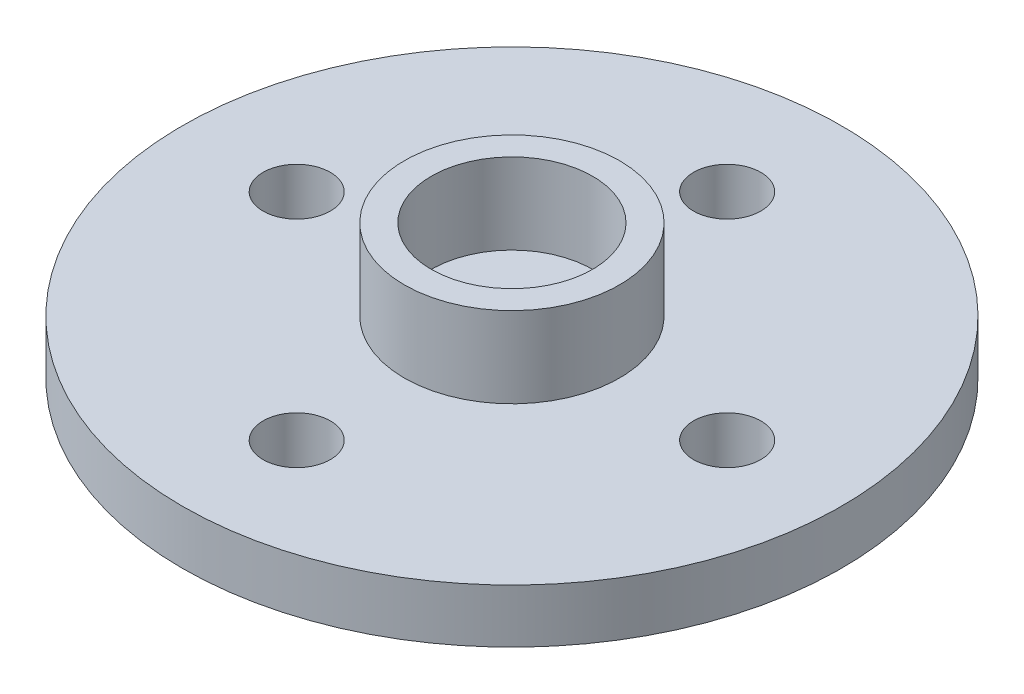
ISO-10303-21;
HEADER;
FILE_DESCRIPTION(('STEP AP214'),'2;1');
FILE_NAME('part.step','',(''),(''),'','','');
FILE_SCHEMA(('AUTOMOTIVE_DESIGN { 1 0 10303 214 1 1 1 1 }'));
ENDSEC;
DATA;
#1=APPLICATION_CONTEXT('core data for automotive mechanical design processes');
#2=APPLICATION_PROTOCOL_DEFINITION('international standard','automotive_design',2000,#1);
#3=PRODUCT_CONTEXT('',#1,'mechanical');
#4=PRODUCT('Part','Part','',(#3));
#5=PRODUCT_RELATED_PRODUCT_CATEGORY('part','',(#4));
#6=PRODUCT_DEFINITION_FORMATION('','',#4);
#7=PRODUCT_DEFINITION_CONTEXT('part definition',#1,'design');
#8=PRODUCT_DEFINITION('design','',#6,#7);
#9=PRODUCT_DEFINITION_SHAPE('','',#8);
#10=(LENGTH_UNIT() NAMED_UNIT(*) SI_UNIT(.MILLI.,.METRE.));
#11=(NAMED_UNIT(*) PLANE_ANGLE_UNIT() SI_UNIT($,.RADIAN.));
#12=(NAMED_UNIT(*) SI_UNIT($,.STERADIAN.) SOLID_ANGLE_UNIT());
#13=UNCERTAINTY_MEASURE_WITH_UNIT(LENGTH_MEASURE(1.E-05),#10,'distance_accuracy_value','');
#14=(GEOMETRIC_REPRESENTATION_CONTEXT(3) GLOBAL_UNCERTAINTY_ASSIGNED_CONTEXT((#13)) GLOBAL_UNIT_ASSIGNED_CONTEXT((#10,
#11,#12)) REPRESENTATION_CONTEXT('',''));
#15=CARTESIAN_POINT('',(0.,0.,0.));
#16=DIRECTION('',(0.,0.,1.));
#17=DIRECTION('',(1.,0.,0.));
#18=AXIS2_PLACEMENT_3D('',#15,#16,#17);
#19=CARTESIAN_POINT('',(0.,2.,0.));
#20=DIRECTION('',(0.,-1.,0.));
#21=DIRECTION('',(0.,0.,-1.));
#22=AXIS2_PLACEMENT_3D('',#19,#20,#21);
#23=CYLINDRICAL_SURFACE('',#22,12.25);
#24=CARTESIAN_POINT('',(0.,2.,0.));
#25=DIRECTION('',(0.,1.,0.));
#26=DIRECTION('',(0.,0.,1.));
#27=AXIS2_PLACEMENT_3D('',#24,#25,#26);
#28=CIRCLE('',#27,12.25);
#29=CARTESIAN_POINT('',(0.,2.,12.25));
#30=VERTEX_POINT('',#29);
#31=EDGE_CURVE('E40',#30,#30,#28,.T.);
#32=ORIENTED_EDGE('',*,*,#31,.F.);
#33=EDGE_LOOP('',(#32));
#34=FACE_BOUND('',#33,.T.);
#35=CARTESIAN_POINT('',(0.,0.,0.));
#36=DIRECTION('',(0.,1.,0.));
#37=DIRECTION('',(0.,0.,1.));
#38=AXIS2_PLACEMENT_3D('',#35,#36,#37);
#39=CIRCLE('',#38,12.25);
#40=CARTESIAN_POINT('',(0.,0.,12.25));
#41=VERTEX_POINT('',#40);
#42=EDGE_CURVE('E45',#41,#41,#39,.T.);
#43=ORIENTED_EDGE('',*,*,#42,.T.);
#44=EDGE_LOOP('',(#43));
#45=FACE_BOUND('',#44,.T.);
#46=ADVANCED_FACE('F33',(#34,#45),#23,.T.);
#47=CARTESIAN_POINT('',(0.,2.,0.));
#48=DIRECTION('',(0.,1.,0.));
#49=DIRECTION('',(0.,0.,1.));
#50=AXIS2_PLACEMENT_3D('',#47,#48,#49);
#51=PLANE('',#50);
#52=CARTESIAN_POINT('',(-8.,2.,0.));
#53=DIRECTION('',(0.,1.,0.));
#54=DIRECTION('',(0.,0.,1.));
#55=AXIS2_PLACEMENT_3D('',#52,#53,#54);
#56=CIRCLE('',#55,1.25);
#57=CARTESIAN_POINT('',(-8.,2.,1.25));
#58=VERTEX_POINT('',#57);
#59=EDGE_CURVE('E57',#58,#58,#56,.T.);
#60=ORIENTED_EDGE('',*,*,#59,.F.);
#61=EDGE_LOOP('',(#60));
#62=FACE_BOUND('',#61,.T.);
#63=CARTESIAN_POINT('',(0.,2.,-8.));
#64=DIRECTION('',(0.,1.,0.));
#65=DIRECTION('',(0.,0.,1.));
#66=AXIS2_PLACEMENT_3D('',#63,#64,#65);
#67=CIRCLE('',#66,1.25);
#68=CARTESIAN_POINT('',(0.,2.,-6.75));
#69=VERTEX_POINT('',#68);
#70=EDGE_CURVE('E103',#69,#69,#67,.T.);
#71=ORIENTED_EDGE('',*,*,#70,.F.);
#72=EDGE_LOOP('',(#71));
#73=FACE_BOUND('',#72,.T.);
#74=CARTESIAN_POINT('',(8.,2.,0.));
#75=DIRECTION('',(0.,1.,0.));
#76=DIRECTION('',(0.,0.,1.));
#77=AXIS2_PLACEMENT_3D('',#74,#75,#76);
#78=CIRCLE('',#77,1.25);
#79=CARTESIAN_POINT('',(8.,2.,1.25));
#80=VERTEX_POINT('',#79);
#81=EDGE_CURVE('E107',#80,#80,#78,.T.);
#82=ORIENTED_EDGE('',*,*,#81,.F.);
#83=EDGE_LOOP('',(#82));
#84=FACE_BOUND('',#83,.T.);
#85=CARTESIAN_POINT('',(0.,2.,8.));
#86=DIRECTION('',(0.,1.,0.));
#87=DIRECTION('',(0.,0.,1.));
#88=AXIS2_PLACEMENT_3D('',#85,#86,#87);
#89=CIRCLE('',#88,1.25);
#90=CARTESIAN_POINT('',(0.,2.,9.25));
#91=VERTEX_POINT('',#90);
#92=EDGE_CURVE('E111',#91,#91,#89,.T.);
#93=ORIENTED_EDGE('',*,*,#92,.F.);
#94=EDGE_LOOP('',(#93));
#95=FACE_BOUND('',#94,.T.);
#96=CARTESIAN_POINT('',(0.,2.,0.));
#97=DIRECTION('',(0.,1.,0.));
#98=DIRECTION('',(0.,0.,1.));
#99=AXIS2_PLACEMENT_3D('',#96,#97,#98);
#100=CIRCLE('',#99,4.);
#101=CARTESIAN_POINT('',(0.,2.,4.));
#102=VERTEX_POINT('',#101);
#103=EDGE_CURVE('E10',#102,#102,#100,.T.);
#104=ORIENTED_EDGE('',*,*,#103,.F.);
#105=EDGE_LOOP('',(#104));
#106=FACE_BOUND('',#105,.T.);
#107=ORIENTED_EDGE('',*,*,#31,.T.);
#108=EDGE_LOOP('',(#107));
#109=FACE_BOUND('',#108,.T.);
#110=ADVANCED_FACE('F82',(#62,#73,#84,#95,#106,#109),#51,.T.);
#111=CARTESIAN_POINT('',(0.,0.,0.));
#112=DIRECTION('',(0.,1.,0.));
#113=DIRECTION('',(0.,0.,1.));
#114=AXIS2_PLACEMENT_3D('',#111,#112,#113);
#115=PLANE('',#114);
#116=CARTESIAN_POINT('',(-8.,0.,0.));
#117=DIRECTION('',(0.,1.,0.));
#118=DIRECTION('',(0.,0.,1.));
#119=AXIS2_PLACEMENT_3D('',#116,#117,#118);
#120=CIRCLE('',#119,1.25);
#121=CARTESIAN_POINT('',(-8.,0.,1.25));
#122=VERTEX_POINT('',#121);
#123=EDGE_CURVE('E36',#122,#122,#120,.T.);
#124=ORIENTED_EDGE('',*,*,#123,.T.);
#125=EDGE_LOOP('',(#124));
#126=FACE_BOUND('',#125,.T.);
#127=CARTESIAN_POINT('',(0.,0.,-8.));
#128=DIRECTION('',(0.,1.,0.));
#129=DIRECTION('',(0.,0.,1.));
#130=AXIS2_PLACEMENT_3D('',#127,#128,#129);
#131=CIRCLE('',#130,1.25);
#132=CARTESIAN_POINT('',(0.,0.,-6.75));
#133=VERTEX_POINT('',#132);
#134=EDGE_CURVE('E59',#133,#133,#131,.T.);
#135=ORIENTED_EDGE('',*,*,#134,.T.);
#136=EDGE_LOOP('',(#135));
#137=FACE_BOUND('',#136,.T.);
#138=CARTESIAN_POINT('',(8.,0.,0.));
#139=DIRECTION('',(0.,1.,0.));
#140=DIRECTION('',(0.,0.,1.));
#141=AXIS2_PLACEMENT_3D('',#138,#139,#140);
#142=CIRCLE('',#141,1.25);
#143=CARTESIAN_POINT('',(8.,0.,1.25));
#144=VERTEX_POINT('',#143);
#145=EDGE_CURVE('E56',#144,#144,#142,.T.);
#146=ORIENTED_EDGE('',*,*,#145,.T.);
#147=EDGE_LOOP('',(#146));
#148=FACE_BOUND('',#147,.T.);
#149=CARTESIAN_POINT('',(0.,0.,8.));
#150=DIRECTION('',(0.,1.,0.));
#151=DIRECTION('',(0.,0.,1.));
#152=AXIS2_PLACEMENT_3D('',#149,#150,#151);
#153=CIRCLE('',#152,1.25);
#154=CARTESIAN_POINT('',(0.,0.,9.25));
#155=VERTEX_POINT('',#154);
#156=EDGE_CURVE('E53',#155,#155,#153,.T.);
#157=ORIENTED_EDGE('',*,*,#156,.T.);
#158=EDGE_LOOP('',(#157));
#159=FACE_BOUND('',#158,.T.);
#160=ORIENTED_EDGE('',*,*,#42,.F.);
#161=EDGE_LOOP('',(#160));
#162=FACE_BOUND('',#161,.T.);
#163=ADVANCED_FACE('F73',(#126,#137,#148,#159,#162),#115,.F.);
#164=CARTESIAN_POINT('',(0.,5.,0.));
#165=DIRECTION('',(0.,-1.,0.));
#166=DIRECTION('',(0.,0.,-1.));
#167=AXIS2_PLACEMENT_3D('',#164,#165,#166);
#168=CYLINDRICAL_SURFACE('',#167,4.);
#169=CARTESIAN_POINT('',(0.,5.,0.));
#170=DIRECTION('',(0.,1.,0.));
#171=DIRECTION('',(0.,0.,1.));
#172=AXIS2_PLACEMENT_3D('',#169,#170,#171);
#173=CIRCLE('',#172,4.);
#174=CARTESIAN_POINT('',(0.,5.,4.));
#175=VERTEX_POINT('',#174);
#176=EDGE_CURVE('E48',#175,#175,#173,.T.);
#177=ORIENTED_EDGE('',*,*,#176,.F.);
#178=EDGE_LOOP('',(#177));
#179=FACE_BOUND('',#178,.T.);
#180=ORIENTED_EDGE('',*,*,#103,.T.);
#181=EDGE_LOOP('',(#180));
#182=FACE_BOUND('',#181,.T.);
#183=ADVANCED_FACE('F71',(#179,#182),#168,.T.);
#184=CARTESIAN_POINT('',(0.,5.,0.));
#185=DIRECTION('',(0.,1.,0.));
#186=DIRECTION('',(0.,0.,1.));
#187=AXIS2_PLACEMENT_3D('',#184,#185,#186);
#188=PLANE('',#187);
#189=CARTESIAN_POINT('',(0.,5.,0.));
#190=DIRECTION('',(0.,1.,0.));
#191=DIRECTION('',(0.,0.,1.));
#192=AXIS2_PLACEMENT_3D('',#189,#190,#191);
#193=CIRCLE('',#192,3.);
#194=CARTESIAN_POINT('',(0.,5.,3.));
#195=VERTEX_POINT('',#194);
#196=EDGE_CURVE('E116',#195,#195,#193,.T.);
#197=ORIENTED_EDGE('',*,*,#196,.F.);
#198=EDGE_LOOP('',(#197));
#199=FACE_BOUND('',#198,.T.);
#200=ORIENTED_EDGE('',*,*,#176,.T.);
#201=EDGE_LOOP('',(#200));
#202=FACE_BOUND('',#201,.T.);
#203=ADVANCED_FACE('F69',(#199,#202),#188,.T.);
#204=CARTESIAN_POINT('',(0.,-1.,8.));
#205=DIRECTION('',(0.,1.,0.));
#206=DIRECTION('',(0.,0.,1.));
#207=AXIS2_PLACEMENT_3D('',#204,#205,#206);
#208=CYLINDRICAL_SURFACE('',#207,1.25);
#209=ORIENTED_EDGE('',*,*,#92,.T.);
#210=EDGE_LOOP('',(#209));
#211=FACE_BOUND('',#210,.T.);
#212=ORIENTED_EDGE('',*,*,#156,.F.);
#213=EDGE_LOOP('',(#212));
#214=FACE_BOUND('',#213,.T.);
#215=ADVANCED_FACE('F79',(#211,#214),#208,.F.);
#216=CARTESIAN_POINT('',(8.,-1.,0.));
#217=DIRECTION('',(0.,1.,0.));
#218=DIRECTION('',(0.,0.,1.));
#219=AXIS2_PLACEMENT_3D('',#216,#217,#218);
#220=CYLINDRICAL_SURFACE('',#219,1.25);
#221=ORIENTED_EDGE('',*,*,#81,.T.);
#222=EDGE_LOOP('',(#221));
#223=FACE_BOUND('',#222,.T.);
#224=ORIENTED_EDGE('',*,*,#145,.F.);
#225=EDGE_LOOP('',(#224));
#226=FACE_BOUND('',#225,.T.);
#227=ADVANCED_FACE('F143',(#223,#226),#220,.F.);
#228=CARTESIAN_POINT('',(0.,-1.,-8.));
#229=DIRECTION('',(0.,1.,0.));
#230=DIRECTION('',(0.,0.,1.));
#231=AXIS2_PLACEMENT_3D('',#228,#229,#230);
#232=CYLINDRICAL_SURFACE('',#231,1.25);
#233=ORIENTED_EDGE('',*,*,#70,.T.);
#234=EDGE_LOOP('',(#233));
#235=FACE_BOUND('',#234,.T.);
#236=ORIENTED_EDGE('',*,*,#134,.F.);
#237=EDGE_LOOP('',(#236));
#238=FACE_BOUND('',#237,.T.);
#239=ADVANCED_FACE('F136',(#235,#238),#232,.F.);
#240=CARTESIAN_POINT('',(-8.,-1.,0.));
#241=DIRECTION('',(0.,1.,0.));
#242=DIRECTION('',(0.,0.,1.));
#243=AXIS2_PLACEMENT_3D('',#240,#241,#242);
#244=CYLINDRICAL_SURFACE('',#243,1.25);
#245=ORIENTED_EDGE('',*,*,#59,.T.);
#246=EDGE_LOOP('',(#245));
#247=FACE_BOUND('',#246,.T.);
#248=ORIENTED_EDGE('',*,*,#123,.F.);
#249=EDGE_LOOP('',(#248));
#250=FACE_BOUND('',#249,.T.);
#251=ADVANCED_FACE('F127',(#247,#250),#244,.F.);
#252=CARTESIAN_POINT('',(0.,2.,0.));
#253=DIRECTION('',(0.,1.,0.));
#254=DIRECTION('',(0.,0.,1.));
#255=AXIS2_PLACEMENT_3D('',#252,#253,#254);
#256=CYLINDRICAL_SURFACE('',#255,3.);
#257=CARTESIAN_POINT('',(0.,2.,0.));
#258=DIRECTION('',(0.,1.,0.));
#259=DIRECTION('',(0.,0.,1.));
#260=AXIS2_PLACEMENT_3D('',#257,#258,#259);
#261=CIRCLE('',#260,3.);
#262=CARTESIAN_POINT('',(0.,2.,3.));
#263=VERTEX_POINT('',#262);
#264=EDGE_CURVE('E113',#263,#263,#261,.T.);
#265=ORIENTED_EDGE('',*,*,#264,.F.);
#266=EDGE_LOOP('',(#265));
#267=FACE_BOUND('',#266,.T.);
#268=ORIENTED_EDGE('',*,*,#196,.T.);
#269=EDGE_LOOP('',(#268));
#270=FACE_BOUND('',#269,.T.);
#271=ADVANCED_FACE('F124',(#267,#270),#256,.F.);
#272=CARTESIAN_POINT('',(0.,2.,0.));
#273=DIRECTION('',(0.,1.,0.));
#274=DIRECTION('',(0.,0.,1.));
#275=AXIS2_PLACEMENT_3D('',#272,#273,#274);
#276=PLANE('',#275);
#277=ORIENTED_EDGE('',*,*,#264,.T.);
#278=EDGE_LOOP('',(#277));
#279=FACE_BOUND('',#278,.T.);
#280=ADVANCED_FACE('F126',(#279),#276,.T.);
#281=CLOSED_SHELL('',(#46,#110,#163,#183,#203,#215,#227,#239,#251,#271,#280));
#282=MANIFOLD_SOLID_BREP('B2',#281);
#283=ADVANCED_BREP_SHAPE_REPRESENTATION('',(#18,#282),#14);
#284=SHAPE_DEFINITION_REPRESENTATION(#9,#283);
ENDSEC;
END-ISO-10303-21;
